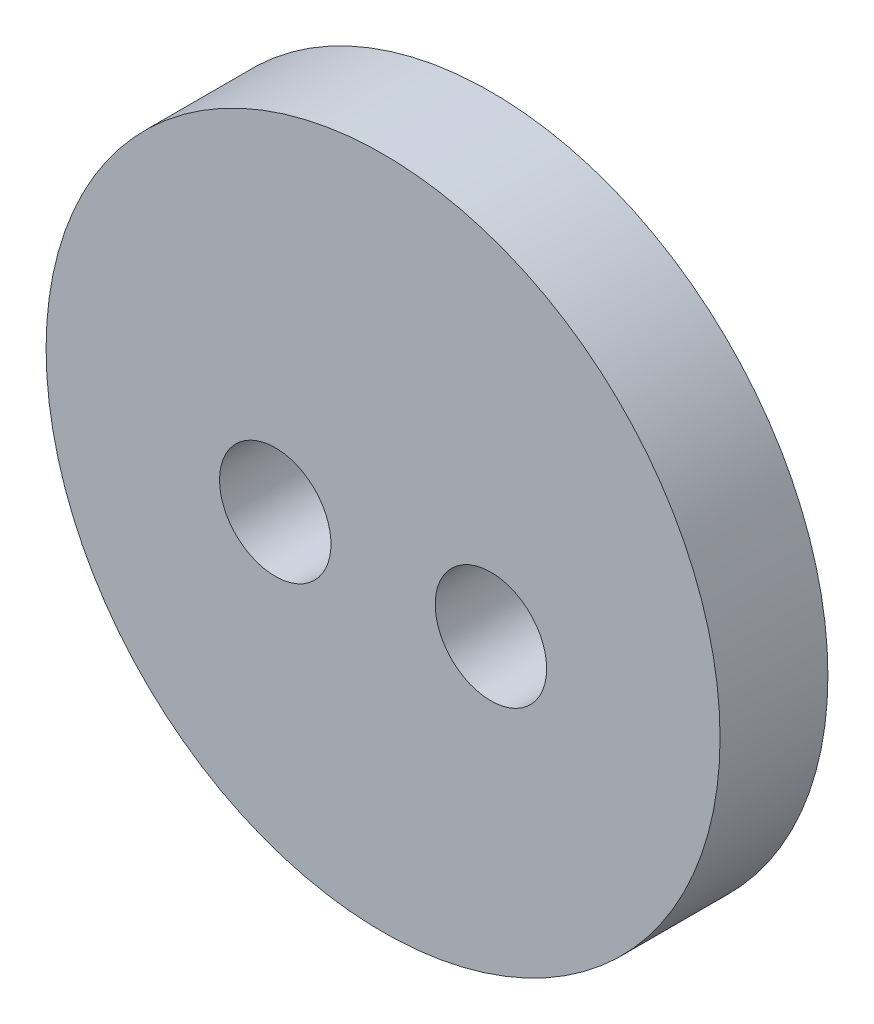
ISO-10303-21;
HEADER;
FILE_DESCRIPTION(('STEP AP214'),'2;1');
FILE_NAME('part.step','',(''),(''),'','','');
FILE_SCHEMA(('AUTOMOTIVE_DESIGN { 1 0 10303 214 1 1 1 1 }'));
ENDSEC;
DATA;
#1=APPLICATION_CONTEXT('core data for automotive mechanical design processes');
#2=APPLICATION_PROTOCOL_DEFINITION('international standard','automotive_design',2000,#1);
#3=PRODUCT_CONTEXT('',#1,'mechanical');
#4=PRODUCT('Part','Part','',(#3));
#5=PRODUCT_RELATED_PRODUCT_CATEGORY('part','',(#4));
#6=PRODUCT_DEFINITION_FORMATION('','',#4);
#7=PRODUCT_DEFINITION_CONTEXT('part definition',#1,'design');
#8=PRODUCT_DEFINITION('design','',#6,#7);
#9=PRODUCT_DEFINITION_SHAPE('','',#8);
#10=(LENGTH_UNIT() NAMED_UNIT(*) SI_UNIT(.MILLI.,.METRE.));
#11=(NAMED_UNIT(*) PLANE_ANGLE_UNIT() SI_UNIT($,.RADIAN.));
#12=(NAMED_UNIT(*) SI_UNIT($,.STERADIAN.) SOLID_ANGLE_UNIT());
#13=UNCERTAINTY_MEASURE_WITH_UNIT(LENGTH_MEASURE(1.E-05),#10,'distance_accuracy_value','');
#14=(GEOMETRIC_REPRESENTATION_CONTEXT(3) GLOBAL_UNCERTAINTY_ASSIGNED_CONTEXT((#13)) GLOBAL_UNIT_ASSIGNED_CONTEXT((#10,
#11,#12)) REPRESENTATION_CONTEXT('',''));
#15=CARTESIAN_POINT('',(0.,0.,0.));
#16=DIRECTION('',(0.,0.,1.));
#17=DIRECTION('',(1.,0.,0.));
#18=AXIS2_PLACEMENT_3D('',#15,#16,#17);
#19=CARTESIAN_POINT('',(0.,0.,3.));
#20=DIRECTION('',(0.,0.,-1.));
#21=DIRECTION('',(-1.,0.,0.));
#22=AXIS2_PLACEMENT_3D('',#19,#20,#21);
#23=CYLINDRICAL_SURFACE('',#22,9.375);
#24=CARTESIAN_POINT('',(0.,0.,3.));
#25=DIRECTION('',(0.,0.,1.));
#26=DIRECTION('',(1.,0.,0.));
#27=AXIS2_PLACEMENT_3D('',#24,#25,#26);
#28=CIRCLE('',#27,9.375);
#29=CARTESIAN_POINT('',(9.375,0.,3.));
#30=VERTEX_POINT('',#29);
#31=EDGE_CURVE('E10',#30,#30,#28,.T.);
#32=ORIENTED_EDGE('',*,*,#31,.F.);
#33=EDGE_LOOP('',(#32));
#34=FACE_BOUND('',#33,.T.);
#35=CARTESIAN_POINT('',(0.,0.,0.));
#36=DIRECTION('',(0.,0.,1.));
#37=DIRECTION('',(1.,0.,0.));
#38=AXIS2_PLACEMENT_3D('',#35,#36,#37);
#39=CIRCLE('',#38,9.375);
#40=CARTESIAN_POINT('',(9.375,0.,0.));
#41=VERTEX_POINT('',#40);
#42=EDGE_CURVE('E42',#41,#41,#39,.T.);
#43=ORIENTED_EDGE('',*,*,#42,.T.);
#44=EDGE_LOOP('',(#43));
#45=FACE_BOUND('',#44,.T.);
#46=ADVANCED_FACE('F39',(#34,#45),#23,.T.);
#47=CARTESIAN_POINT('',(0.,0.,3.));
#48=DIRECTION('',(0.,0.,1.));
#49=DIRECTION('',(1.,0.,0.));
#50=AXIS2_PLACEMENT_3D('',#47,#48,#49);
#51=PLANE('',#50);
#52=CARTESIAN_POINT('',(3.,-0.75,3.));
#53=DIRECTION('',(0.,0.,1.));
#54=DIRECTION('',(1.,0.,0.));
#55=AXIS2_PLACEMENT_3D('',#52,#53,#54);
#56=CIRCLE('',#55,1.55);
#57=CARTESIAN_POINT('',(4.55,-0.75,3.));
#58=VERTEX_POINT('',#57);
#59=EDGE_CURVE('E61',#58,#58,#56,.T.);
#60=ORIENTED_EDGE('',*,*,#59,.F.);
#61=EDGE_LOOP('',(#60));
#62=FACE_BOUND('',#61,.T.);
#63=CARTESIAN_POINT('',(-3.,-0.75,3.));
#64=DIRECTION('',(0.,0.,1.));
#65=DIRECTION('',(-1.,0.,0.));
#66=AXIS2_PLACEMENT_3D('',#63,#64,#65);
#67=CIRCLE('',#66,1.55);
#68=CARTESIAN_POINT('',(-4.55,-0.75,3.));
#69=VERTEX_POINT('',#68);
#70=EDGE_CURVE('E53',#69,#69,#67,.T.);
#71=ORIENTED_EDGE('',*,*,#70,.F.);
#72=EDGE_LOOP('',(#71));
#73=FACE_BOUND('',#72,.T.);
#74=ORIENTED_EDGE('',*,*,#31,.T.);
#75=EDGE_LOOP('',(#74));
#76=FACE_BOUND('',#75,.T.);
#77=ADVANCED_FACE('F79',(#62,#73,#76),#51,.T.);
#78=CARTESIAN_POINT('',(0.,0.,0.));
#79=DIRECTION('',(0.,0.,1.));
#80=DIRECTION('',(1.,0.,0.));
#81=AXIS2_PLACEMENT_3D('',#78,#79,#80);
#82=PLANE('',#81);
#83=CARTESIAN_POINT('',(3.,-0.75,0.));
#84=DIRECTION('',(0.,0.,1.));
#85=DIRECTION('',(1.,0.,0.));
#86=AXIS2_PLACEMENT_3D('',#83,#84,#85);
#87=CIRCLE('',#86,1.55);
#88=CARTESIAN_POINT('',(4.55,-0.75,0.));
#89=VERTEX_POINT('',#88);
#90=EDGE_CURVE('E51',#89,#89,#87,.T.);
#91=ORIENTED_EDGE('',*,*,#90,.T.);
#92=EDGE_LOOP('',(#91));
#93=FACE_BOUND('',#92,.T.);
#94=CARTESIAN_POINT('',(-3.,-0.75,0.));
#95=DIRECTION('',(0.,0.,1.));
#96=DIRECTION('',(-1.,0.,0.));
#97=AXIS2_PLACEMENT_3D('',#94,#95,#96);
#98=CIRCLE('',#97,1.55);
#99=CARTESIAN_POINT('',(-4.55,-0.75,0.));
#100=VERTEX_POINT('',#99);
#101=EDGE_CURVE('E57',#100,#100,#98,.T.);
#102=ORIENTED_EDGE('',*,*,#101,.T.);
#103=EDGE_LOOP('',(#102));
#104=FACE_BOUND('',#103,.T.);
#105=ORIENTED_EDGE('',*,*,#42,.F.);
#106=EDGE_LOOP('',(#105));
#107=FACE_BOUND('',#106,.T.);
#108=ADVANCED_FACE('F69',(#93,#104,#107),#82,.F.);
#109=CARTESIAN_POINT('',(-3.,-0.75,0.));
#110=DIRECTION('',(0.,0.,1.));
#111=DIRECTION('',(1.,0.,0.));
#112=AXIS2_PLACEMENT_3D('',#109,#110,#111);
#113=CYLINDRICAL_SURFACE('',#112,1.55);
#114=ORIENTED_EDGE('',*,*,#101,.F.);
#115=EDGE_LOOP('',(#114));
#116=FACE_BOUND('',#115,.T.);
#117=ORIENTED_EDGE('',*,*,#70,.T.);
#118=EDGE_LOOP('',(#117));
#119=FACE_BOUND('',#118,.T.);
#120=ADVANCED_FACE('F75',(#116,#119),#113,.F.);
#121=CARTESIAN_POINT('',(3.,-0.75,0.));
#122=DIRECTION('',(0.,0.,1.));
#123=DIRECTION('',(1.,0.,0.));
#124=AXIS2_PLACEMENT_3D('',#121,#122,#123);
#125=CYLINDRICAL_SURFACE('',#124,1.55);
#126=ORIENTED_EDGE('',*,*,#90,.F.);
#127=EDGE_LOOP('',(#126));
#128=FACE_BOUND('',#127,.T.);
#129=ORIENTED_EDGE('',*,*,#59,.T.);
#130=EDGE_LOOP('',(#129));
#131=FACE_BOUND('',#130,.T.);
#132=ADVANCED_FACE('F72',(#128,#131),#125,.F.);
#133=CLOSED_SHELL('',(#46,#77,#108,#120,#132));
#134=MANIFOLD_SOLID_BREP('B2',#133);
#135=ADVANCED_BREP_SHAPE_REPRESENTATION('',(#18,#134),#14);
#136=SHAPE_DEFINITION_REPRESENTATION(#9,#135);
ENDSEC;
END-ISO-10303-21;
